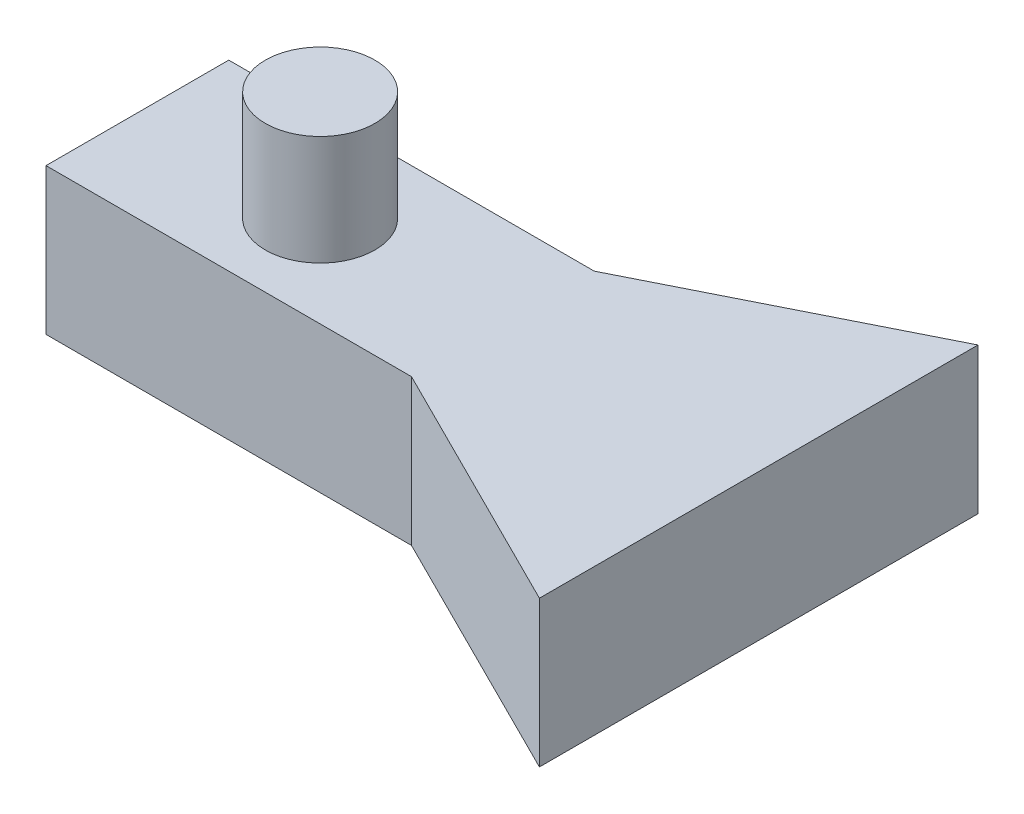
ISO-10303-21;
HEADER;
FILE_DESCRIPTION(('STEP AP214'),'2;1');
FILE_NAME('part.step','',(''),(''),'','','');
FILE_SCHEMA(('AUTOMOTIVE_DESIGN { 1 0 10303 214 1 1 1 1 }'));
ENDSEC;
DATA;
#1=APPLICATION_CONTEXT('core data for automotive mechanical design processes');
#2=APPLICATION_PROTOCOL_DEFINITION('international standard','automotive_design',2000,#1);
#3=PRODUCT_CONTEXT('',#1,'mechanical');
#4=PRODUCT('Part','Part','',(#3));
#5=PRODUCT_RELATED_PRODUCT_CATEGORY('part','',(#4));
#6=PRODUCT_DEFINITION_FORMATION('','',#4);
#7=PRODUCT_DEFINITION_CONTEXT('part definition',#1,'design');
#8=PRODUCT_DEFINITION('design','',#6,#7);
#9=PRODUCT_DEFINITION_SHAPE('','',#8);
#10=(LENGTH_UNIT() NAMED_UNIT(*) SI_UNIT(.MILLI.,.METRE.));
#11=(NAMED_UNIT(*) PLANE_ANGLE_UNIT() SI_UNIT($,.RADIAN.));
#12=(NAMED_UNIT(*) SI_UNIT($,.STERADIAN.) SOLID_ANGLE_UNIT());
#13=UNCERTAINTY_MEASURE_WITH_UNIT(LENGTH_MEASURE(1.E-05),#10,'distance_accuracy_value','');
#14=(GEOMETRIC_REPRESENTATION_CONTEXT(3) GLOBAL_UNCERTAINTY_ASSIGNED_CONTEXT((#13)) GLOBAL_UNIT_ASSIGNED_CONTEXT((#10,
#11,#12)) REPRESENTATION_CONTEXT('',''));
#15=CARTESIAN_POINT('',(0.,0.,0.));
#16=DIRECTION('',(0.,0.,1.));
#17=DIRECTION('',(1.,0.,0.));
#18=AXIS2_PLACEMENT_3D('',#15,#16,#17);
#19=CARTESIAN_POINT('',(200.,400.,-400.));
#20=DIRECTION('',(-0.447213595499958,0.,0.894427190999916));
#21=DIRECTION('',(0.894427190999916,0.,0.447213595499958));
#22=AXIS2_PLACEMENT_3D('',#19,#20,#21);
#23=PLANE('',#22);
#24=DIRECTION('',(-0.894427190999916,0.,-0.447213595499958));
#25=VECTOR('',#24,1.);
#26=CARTESIAN_POINT('',(200.,0.,-400.));
#27=LINE('',#26,#25);
#28=CARTESIAN_POINT('',(1700.,0.,350.));
#29=VERTEX_POINT('',#28);
#30=CARTESIAN_POINT('',(1000.,0.,0.));
#31=VERTEX_POINT('',#30);
#32=EDGE_CURVE('E116',#29,#31,#27,.T.);
#33=ORIENTED_EDGE('',*,*,#32,.F.);
#34=DIRECTION('',(0.,-1.,0.));
#35=VECTOR('',#34,1.);
#36=CARTESIAN_POINT('',(1700.,400.,350.));
#37=LINE('',#36,#35);
#38=CARTESIAN_POINT('',(1700.,400.,350.));
#39=VERTEX_POINT('',#38);
#40=EDGE_CURVE('E11',#39,#29,#37,.T.);
#41=ORIENTED_EDGE('',*,*,#40,.F.);
#42=DIRECTION('',(-0.894427190999916,0.,-0.447213595499958));
#43=VECTOR('',#42,1.);
#44=CARTESIAN_POINT('',(200.,400.,-400.));
#45=LINE('',#44,#43);
#46=CARTESIAN_POINT('',(1000.,400.,0.));
#47=VERTEX_POINT('',#46);
#48=EDGE_CURVE('E131',#39,#47,#45,.T.);
#49=ORIENTED_EDGE('',*,*,#48,.T.);
#50=DIRECTION('',(0.,-1.,0.));
#51=VECTOR('',#50,1.);
#52=CARTESIAN_POINT('',(1000.,400.,0.));
#53=LINE('',#52,#51);
#54=EDGE_CURVE('E79',#47,#31,#53,.T.);
#55=ORIENTED_EDGE('',*,*,#54,.T.);
#56=EDGE_LOOP('',(#33,#41,#49,#55));
#57=FACE_BOUND('',#56,.T.);
#58=ADVANCED_FACE('F35',(#57),#23,.T.);
#59=CARTESIAN_POINT('',(1700.,400.,0.));
#60=DIRECTION('',(1.,0.,0.));
#61=DIRECTION('',(0.,0.,-1.));
#62=AXIS2_PLACEMENT_3D('',#59,#60,#61);
#63=PLANE('',#62);
#64=DIRECTION('',(0.,0.,1.));
#65=VECTOR('',#64,1.);
#66=CARTESIAN_POINT('',(1700.,0.,0.));
#67=LINE('',#66,#65);
#68=CARTESIAN_POINT('',(1700.,0.,-850.));
#69=VERTEX_POINT('',#68);
#70=EDGE_CURVE('E119',#69,#29,#67,.T.);
#71=ORIENTED_EDGE('',*,*,#70,.F.);
#72=DIRECTION('',(0.,-1.,0.));
#73=VECTOR('',#72,1.);
#74=CARTESIAN_POINT('',(1700.,400.,-850.));
#75=LINE('',#74,#73);
#76=CARTESIAN_POINT('',(1700.,400.,-850.));
#77=VERTEX_POINT('',#76);
#78=EDGE_CURVE('E43',#77,#69,#75,.T.);
#79=ORIENTED_EDGE('',*,*,#78,.F.);
#80=DIRECTION('',(0.,0.,1.));
#81=VECTOR('',#80,1.);
#82=CARTESIAN_POINT('',(1700.,400.,0.));
#83=LINE('',#82,#81);
#84=EDGE_CURVE('E144',#77,#39,#83,.T.);
#85=ORIENTED_EDGE('',*,*,#84,.T.);
#86=ORIENTED_EDGE('',*,*,#40,.T.);
#87=EDGE_LOOP('',(#71,#79,#85,#86));
#88=FACE_BOUND('',#87,.T.);
#89=ADVANCED_FACE('F140',(#88),#63,.T.);
#90=CARTESIAN_POINT('',(0.,400.,0.));
#91=DIRECTION('',(-0.447213595499958,0.,-0.894427190999916));
#92=DIRECTION('',(-0.894427190999916,0.,0.447213595499958));
#93=AXIS2_PLACEMENT_3D('',#90,#91,#92);
#94=PLANE('',#93);
#95=DIRECTION('',(0.894427190999916,0.,-0.447213595499958));
#96=VECTOR('',#95,1.);
#97=CARTESIAN_POINT('',(0.,0.,0.));
#98=LINE('',#97,#96);
#99=CARTESIAN_POINT('',(1000.,0.,-500.));
#100=VERTEX_POINT('',#99);
#101=EDGE_CURVE('E123',#100,#69,#98,.T.);
#102=ORIENTED_EDGE('',*,*,#101,.F.);
#103=DIRECTION('',(0.,-1.,0.));
#104=VECTOR('',#103,1.);
#105=CARTESIAN_POINT('',(1000.,400.,-500.));
#106=LINE('',#105,#104);
#107=CARTESIAN_POINT('',(1000.,400.,-500.));
#108=VERTEX_POINT('',#107);
#109=EDGE_CURVE('E102',#108,#100,#106,.T.);
#110=ORIENTED_EDGE('',*,*,#109,.F.);
#111=DIRECTION('',(0.894427190999916,0.,-0.447213595499958));
#112=VECTOR('',#111,1.);
#113=CARTESIAN_POINT('',(0.,400.,0.));
#114=LINE('',#113,#112);
#115=EDGE_CURVE('E109',#108,#77,#114,.T.);
#116=ORIENTED_EDGE('',*,*,#115,.T.);
#117=ORIENTED_EDGE('',*,*,#78,.T.);
#118=EDGE_LOOP('',(#102,#110,#116,#117));
#119=FACE_BOUND('',#118,.T.);
#120=ADVANCED_FACE('F137',(#119),#94,.T.);
#121=CARTESIAN_POINT('',(0.,400.,-500.));
#122=DIRECTION('',(0.,0.,-1.));
#123=DIRECTION('',(-1.,0.,0.));
#124=AXIS2_PLACEMENT_3D('',#121,#122,#123);
#125=PLANE('',#124);
#126=DIRECTION('',(1.,0.,0.));
#127=VECTOR('',#126,1.);
#128=CARTESIAN_POINT('',(0.,0.,-500.));
#129=LINE('',#128,#127);
#130=CARTESIAN_POINT('',(0.,0.,-500.));
#131=VERTEX_POINT('',#130);
#132=EDGE_CURVE('E97',#131,#100,#129,.T.);
#133=ORIENTED_EDGE('',*,*,#132,.F.);
#134=DIRECTION('',(0.,-1.,0.));
#135=VECTOR('',#134,1.);
#136=CARTESIAN_POINT('',(0.,400.,-500.));
#137=LINE('',#136,#135);
#138=CARTESIAN_POINT('',(0.,400.,-500.));
#139=VERTEX_POINT('',#138);
#140=EDGE_CURVE('E92',#139,#131,#137,.T.);
#141=ORIENTED_EDGE('',*,*,#140,.F.);
#142=DIRECTION('',(1.,0.,0.));
#143=VECTOR('',#142,1.);
#144=CARTESIAN_POINT('',(0.,400.,-500.));
#145=LINE('',#144,#143);
#146=EDGE_CURVE('E95',#139,#108,#145,.T.);
#147=ORIENTED_EDGE('',*,*,#146,.T.);
#148=ORIENTED_EDGE('',*,*,#109,.T.);
#149=EDGE_LOOP('',(#133,#141,#147,#148));
#150=FACE_BOUND('',#149,.T.);
#151=ADVANCED_FACE('F94',(#150),#125,.T.);
#152=CARTESIAN_POINT('',(0.,400.,0.));
#153=DIRECTION('',(-1.,0.,0.));
#154=DIRECTION('',(0.,0.,1.));
#155=AXIS2_PLACEMENT_3D('',#152,#153,#154);
#156=PLANE('',#155);
#157=DIRECTION('',(0.,0.,-1.));
#158=VECTOR('',#157,1.);
#159=CARTESIAN_POINT('',(0.,0.,0.));
#160=LINE('',#159,#158);
#161=CARTESIAN_POINT('',(0.,0.,0.));
#162=VERTEX_POINT('',#161);
#163=EDGE_CURVE('E127',#162,#131,#160,.T.);
#164=ORIENTED_EDGE('',*,*,#163,.F.);
#165=DIRECTION('',(0.,-1.,0.));
#166=VECTOR('',#165,1.);
#167=CARTESIAN_POINT('',(0.,400.,0.));
#168=LINE('',#167,#166);
#169=CARTESIAN_POINT('',(0.,400.,0.));
#170=VERTEX_POINT('',#169);
#171=EDGE_CURVE('E72',#170,#162,#168,.T.);
#172=ORIENTED_EDGE('',*,*,#171,.F.);
#173=DIRECTION('',(0.,0.,-1.));
#174=VECTOR('',#173,1.);
#175=CARTESIAN_POINT('',(0.,400.,0.));
#176=LINE('',#175,#174);
#177=EDGE_CURVE('E106',#170,#139,#176,.T.);
#178=ORIENTED_EDGE('',*,*,#177,.T.);
#179=ORIENTED_EDGE('',*,*,#140,.T.);
#180=EDGE_LOOP('',(#164,#172,#178,#179));
#181=FACE_BOUND('',#180,.T.);
#182=ADVANCED_FACE('F111',(#181),#156,.T.);
#183=CARTESIAN_POINT('',(0.,400.,0.));
#184=DIRECTION('',(0.,0.,-1.));
#185=DIRECTION('',(-1.,0.,0.));
#186=AXIS2_PLACEMENT_3D('',#183,#184,#185);
#187=PLANE('',#186);
#188=DIRECTION('',(1.,0.,0.));
#189=VECTOR('',#188,1.);
#190=CARTESIAN_POINT('',(0.,0.,0.));
#191=LINE('',#190,#189);
#192=EDGE_CURVE('E129',#162,#31,#191,.T.);
#193=ORIENTED_EDGE('',*,*,#192,.T.);
#194=ORIENTED_EDGE('',*,*,#54,.F.);
#195=DIRECTION('',(1.,0.,0.));
#196=VECTOR('',#195,1.);
#197=CARTESIAN_POINT('',(0.,400.,0.));
#198=LINE('',#197,#196);
#199=EDGE_CURVE('E51',#170,#47,#198,.T.);
#200=ORIENTED_EDGE('',*,*,#199,.F.);
#201=ORIENTED_EDGE('',*,*,#171,.T.);
#202=EDGE_LOOP('',(#193,#194,#200,#201));
#203=FACE_BOUND('',#202,.T.);
#204=ADVANCED_FACE('F143',(#203),#187,.F.);
#205=CARTESIAN_POINT('',(0.,400.,0.));
#206=DIRECTION('',(0.,1.,0.));
#207=DIRECTION('',(0.,0.,1.));
#208=AXIS2_PLACEMENT_3D('',#205,#206,#207);
#209=PLANE('',#208);
#210=CARTESIAN_POINT('',(500.,400.,-250.));
#211=DIRECTION('',(0.,1.,0.));
#212=DIRECTION('',(0.,0.,1.));
#213=AXIS2_PLACEMENT_3D('',#210,#211,#212);
#214=CIRCLE('',#213,150.);
#215=CARTESIAN_POINT('',(500.,400.,-99.9999999999999));
#216=VERTEX_POINT('',#215);
#217=EDGE_CURVE('E148',#216,#216,#214,.T.);
#218=ORIENTED_EDGE('',*,*,#217,.F.);
#219=EDGE_LOOP('',(#218));
#220=FACE_BOUND('',#219,.T.);
#221=ORIENTED_EDGE('',*,*,#48,.F.);
#222=ORIENTED_EDGE('',*,*,#84,.F.);
#223=ORIENTED_EDGE('',*,*,#115,.F.);
#224=ORIENTED_EDGE('',*,*,#146,.F.);
#225=ORIENTED_EDGE('',*,*,#177,.F.);
#226=ORIENTED_EDGE('',*,*,#199,.T.);
#227=EDGE_LOOP('',(#221,#222,#223,#224,#225,#226));
#228=FACE_BOUND('',#227,.T.);
#229=ADVANCED_FACE('F105',(#220,#228),#209,.T.);
#230=CARTESIAN_POINT('',(0.,0.,0.));
#231=DIRECTION('',(0.,1.,0.));
#232=DIRECTION('',(0.,0.,1.));
#233=AXIS2_PLACEMENT_3D('',#230,#231,#232);
#234=PLANE('',#233);
#235=ORIENTED_EDGE('',*,*,#32,.T.);
#236=ORIENTED_EDGE('',*,*,#192,.F.);
#237=ORIENTED_EDGE('',*,*,#163,.T.);
#238=ORIENTED_EDGE('',*,*,#132,.T.);
#239=ORIENTED_EDGE('',*,*,#101,.T.);
#240=ORIENTED_EDGE('',*,*,#70,.T.);
#241=EDGE_LOOP('',(#235,#236,#237,#238,#239,#240));
#242=FACE_BOUND('',#241,.T.);
#243=ADVANCED_FACE('F142',(#242),#234,.F.);
#244=CARTESIAN_POINT('',(500.,700.,-250.));
#245=DIRECTION('',(0.,-1.,0.));
#246=DIRECTION('',(0.,0.,-1.));
#247=AXIS2_PLACEMENT_3D('',#244,#245,#246);
#248=CYLINDRICAL_SURFACE('',#247,150.);
#249=CARTESIAN_POINT('',(500.,700.,-250.));
#250=DIRECTION('',(0.,1.,0.));
#251=DIRECTION('',(0.,0.,1.));
#252=AXIS2_PLACEMENT_3D('',#249,#250,#251);
#253=CIRCLE('',#252,150.);
#254=CARTESIAN_POINT('',(500.,700.,-99.9999999999999));
#255=VERTEX_POINT('',#254);
#256=EDGE_CURVE('E120',#255,#255,#253,.T.);
#257=ORIENTED_EDGE('',*,*,#256,.F.);
#258=EDGE_LOOP('',(#257));
#259=FACE_BOUND('',#258,.T.);
#260=ORIENTED_EDGE('',*,*,#217,.T.);
#261=EDGE_LOOP('',(#260));
#262=FACE_BOUND('',#261,.T.);
#263=ADVANCED_FACE('F156',(#259,#262),#248,.T.);
#264=CARTESIAN_POINT('',(500.,700.,-250.));
#265=DIRECTION('',(0.,1.,0.));
#266=DIRECTION('',(0.,0.,1.));
#267=AXIS2_PLACEMENT_3D('',#264,#265,#266);
#268=PLANE('',#267);
#269=ORIENTED_EDGE('',*,*,#256,.T.);
#270=EDGE_LOOP('',(#269));
#271=FACE_BOUND('',#270,.T.);
#272=ADVANCED_FACE('F154',(#271),#268,.T.);
#273=CLOSED_SHELL('',(#58,#89,#120,#151,#182,#204,#229,#243,#263,#272));
#274=MANIFOLD_SOLID_BREP('B2',#273);
#275=ADVANCED_BREP_SHAPE_REPRESENTATION('',(#18,#274),#14);
#276=SHAPE_DEFINITION_REPRESENTATION(#9,#275);
ENDSEC;
END-ISO-10303-21;
